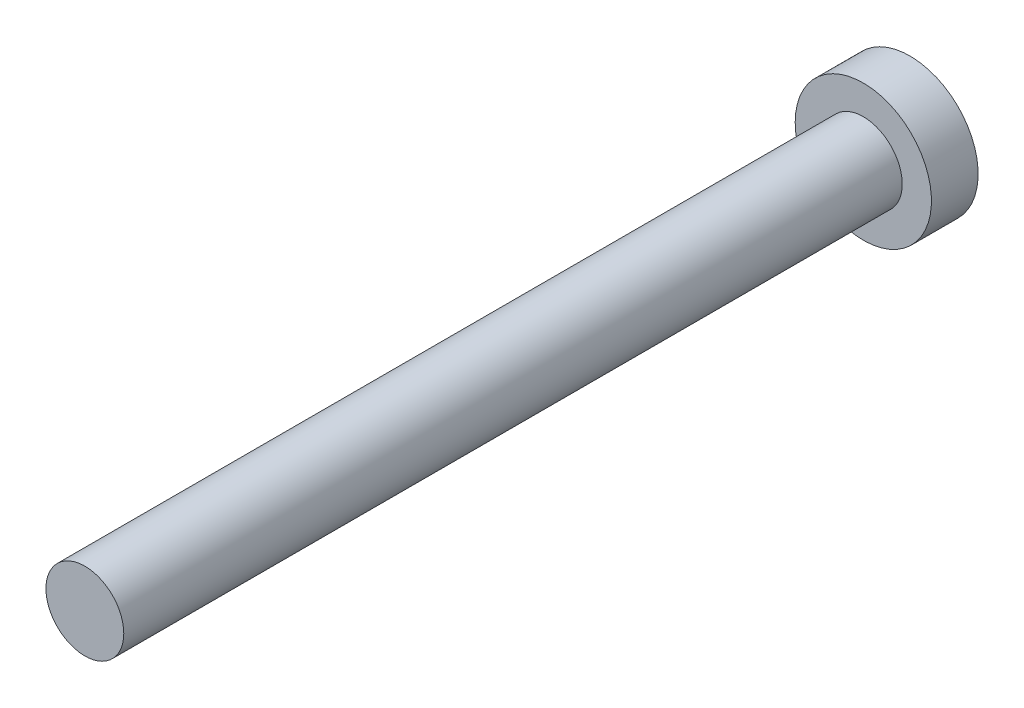
ISO-10303-21;
HEADER;
FILE_DESCRIPTION(('STEP AP214'),'2;1');
FILE_NAME('part.step','',(''),(''),'','','');
FILE_SCHEMA(('AUTOMOTIVE_DESIGN { 1 0 10303 214 1 1 1 1 }'));
ENDSEC;
DATA;
#1=APPLICATION_CONTEXT('core data for automotive mechanical design processes');
#2=APPLICATION_PROTOCOL_DEFINITION('international standard','automotive_design',2000,#1);
#3=PRODUCT_CONTEXT('',#1,'mechanical');
#4=PRODUCT('Part','Part','',(#3));
#5=PRODUCT_RELATED_PRODUCT_CATEGORY('part','',(#4));
#6=PRODUCT_DEFINITION_FORMATION('','',#4);
#7=PRODUCT_DEFINITION_CONTEXT('part definition',#1,'design');
#8=PRODUCT_DEFINITION('design','',#6,#7);
#9=PRODUCT_DEFINITION_SHAPE('','',#8);
#10=(LENGTH_UNIT() NAMED_UNIT(*) SI_UNIT(.MILLI.,.METRE.));
#11=(NAMED_UNIT(*) PLANE_ANGLE_UNIT() SI_UNIT($,.RADIAN.));
#12=(NAMED_UNIT(*) SI_UNIT($,.STERADIAN.) SOLID_ANGLE_UNIT());
#13=UNCERTAINTY_MEASURE_WITH_UNIT(LENGTH_MEASURE(1.E-05),#10,'distance_accuracy_value','');
#14=(GEOMETRIC_REPRESENTATION_CONTEXT(3) GLOBAL_UNCERTAINTY_ASSIGNED_CONTEXT((#13)) GLOBAL_UNIT_ASSIGNED_CONTEXT((#10,
#11,#12)) REPRESENTATION_CONTEXT('',''));
#15=CARTESIAN_POINT('',(0.,0.,0.));
#16=DIRECTION('',(0.,0.,1.));
#17=DIRECTION('',(1.,0.,0.));
#18=AXIS2_PLACEMENT_3D('',#15,#16,#17);
#19=CARTESIAN_POINT('',(0.,0.,0.));
#20=DIRECTION('',(0.,0.,1.));
#21=DIRECTION('',(1.,0.,0.));
#22=AXIS2_PLACEMENT_3D('',#19,#20,#21);
#23=CYLINDRICAL_SURFACE('',#22,2.);
#24=CARTESIAN_POINT('',(0.,0.,0.));
#25=DIRECTION('',(0.,0.,1.));
#26=DIRECTION('',(1.,0.,0.));
#27=AXIS2_PLACEMENT_3D('',#24,#25,#26);
#28=CIRCLE('',#27,2.);
#29=CARTESIAN_POINT('',(2.,0.,0.));
#30=VERTEX_POINT('',#29);
#31=EDGE_CURVE('E10',#30,#30,#28,.T.);
#32=ORIENTED_EDGE('',*,*,#31,.F.);
#33=EDGE_LOOP('',(#32));
#34=FACE_BOUND('',#33,.T.);
#35=CARTESIAN_POINT('',(0.,0.,-40.));
#36=DIRECTION('',(0.,0.,1.));
#37=DIRECTION('',(1.,0.,0.));
#38=AXIS2_PLACEMENT_3D('',#35,#36,#37);
#39=CIRCLE('',#38,2.);
#40=CARTESIAN_POINT('',(2.,0.,-40.));
#41=VERTEX_POINT('',#40);
#42=EDGE_CURVE('E50',#41,#41,#39,.T.);
#43=ORIENTED_EDGE('',*,*,#42,.T.);
#44=EDGE_LOOP('',(#43));
#45=FACE_BOUND('',#44,.T.);
#46=ADVANCED_FACE('F47',(#34,#45),#23,.T.);
#47=CARTESIAN_POINT('',(0.,0.,0.));
#48=DIRECTION('',(0.,0.,-1.));
#49=DIRECTION('',(-1.,0.,0.));
#50=AXIS2_PLACEMENT_3D('',#47,#48,#49);
#51=PLANE('',#50);
#52=ORIENTED_EDGE('',*,*,#31,.T.);
#53=EDGE_LOOP('',(#52));
#54=FACE_BOUND('',#53,.T.);
#55=ADVANCED_FACE('F74',(#54),#51,.F.);
#56=CARTESIAN_POINT('',(0.,0.,-42.4));
#57=DIRECTION('',(0.,0.,1.));
#58=DIRECTION('',(1.,0.,0.));
#59=AXIS2_PLACEMENT_3D('',#56,#57,#58);
#60=CYLINDRICAL_SURFACE('',#59,3.5);
#61=CARTESIAN_POINT('',(0.,0.,-42.4));
#62=DIRECTION('',(0.,0.,-1.));
#63=DIRECTION('',(-1.,0.,0.));
#64=AXIS2_PLACEMENT_3D('',#61,#62,#63);
#65=CIRCLE('',#64,3.5);
#66=CARTESIAN_POINT('',(-3.5,0.,-42.4));
#67=VERTEX_POINT('',#66);
#68=EDGE_CURVE('E59',#67,#67,#65,.T.);
#69=ORIENTED_EDGE('',*,*,#68,.F.);
#70=EDGE_LOOP('',(#69));
#71=FACE_BOUND('',#70,.T.);
#72=CARTESIAN_POINT('',(0.,0.,-40.));
#73=DIRECTION('',(0.,0.,-1.));
#74=DIRECTION('',(-1.,0.,0.));
#75=AXIS2_PLACEMENT_3D('',#72,#73,#74);
#76=CIRCLE('',#75,3.5);
#77=CARTESIAN_POINT('',(-3.5,0.,-40.));
#78=VERTEX_POINT('',#77);
#79=EDGE_CURVE('E61',#78,#78,#76,.T.);
#80=ORIENTED_EDGE('',*,*,#79,.T.);
#81=EDGE_LOOP('',(#80));
#82=FACE_BOUND('',#81,.T.);
#83=ADVANCED_FACE('F71',(#71,#82),#60,.T.);
#84=CARTESIAN_POINT('',(0.,0.,-42.4));
#85=DIRECTION('',(0.,0.,-1.));
#86=DIRECTION('',(-1.,0.,0.));
#87=AXIS2_PLACEMENT_3D('',#84,#85,#86);
#88=PLANE('',#87);
#89=ORIENTED_EDGE('',*,*,#68,.T.);
#90=EDGE_LOOP('',(#89));
#91=FACE_BOUND('',#90,.T.);
#92=ADVANCED_FACE('F69',(#91),#88,.T.);
#93=CARTESIAN_POINT('',(0.,0.,-40.));
#94=DIRECTION('',(0.,0.,-1.));
#95=DIRECTION('',(-1.,0.,0.));
#96=AXIS2_PLACEMENT_3D('',#93,#94,#95);
#97=PLANE('',#96);
#98=ORIENTED_EDGE('',*,*,#42,.F.);
#99=EDGE_LOOP('',(#98));
#100=FACE_BOUND('',#99,.T.);
#101=ORIENTED_EDGE('',*,*,#79,.F.);
#102=EDGE_LOOP('',(#101));
#103=FACE_BOUND('',#102,.T.);
#104=ADVANCED_FACE('F78',(#100,#103),#97,.F.);
#105=CLOSED_SHELL('',(#46,#55,#83,#92,#104));
#106=MANIFOLD_SOLID_BREP('B2',#105);
#107=ADVANCED_BREP_SHAPE_REPRESENTATION('',(#18,#106),#14);
#108=SHAPE_DEFINITION_REPRESENTATION(#9,#107);
ENDSEC;
END-ISO-10303-21;
